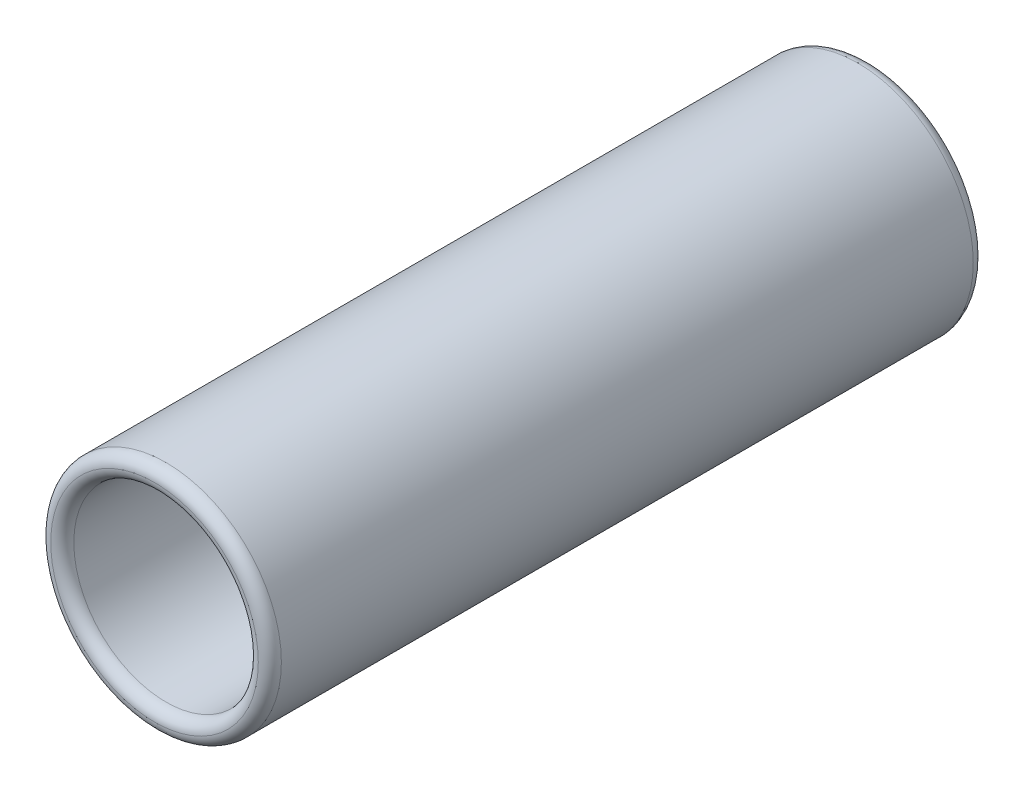
ISO-10303-21;
HEADER;
FILE_DESCRIPTION(('STEP AP214'),'2;1');
FILE_NAME('part.step','',(''),(''),'','','');
FILE_SCHEMA(('AUTOMOTIVE_DESIGN { 1 0 10303 214 1 1 1 1 }'));
ENDSEC;
DATA;
#1=APPLICATION_CONTEXT('core data for automotive mechanical design processes');
#2=APPLICATION_PROTOCOL_DEFINITION('international standard','automotive_design',2000,#1);
#3=PRODUCT_CONTEXT('',#1,'mechanical');
#4=PRODUCT('Part','Part','',(#3));
#5=PRODUCT_RELATED_PRODUCT_CATEGORY('part','',(#4));
#6=PRODUCT_DEFINITION_FORMATION('','',#4);
#7=PRODUCT_DEFINITION_CONTEXT('part definition',#1,'design');
#8=PRODUCT_DEFINITION('design','',#6,#7);
#9=PRODUCT_DEFINITION_SHAPE('','',#8);
#10=(LENGTH_UNIT() NAMED_UNIT(*) SI_UNIT(.MILLI.,.METRE.));
#11=(NAMED_UNIT(*) PLANE_ANGLE_UNIT() SI_UNIT($,.RADIAN.));
#12=(NAMED_UNIT(*) SI_UNIT($,.STERADIAN.) SOLID_ANGLE_UNIT());
#13=UNCERTAINTY_MEASURE_WITH_UNIT(LENGTH_MEASURE(1.E-05),#10,'distance_accuracy_value','');
#14=(GEOMETRIC_REPRESENTATION_CONTEXT(3) GLOBAL_UNCERTAINTY_ASSIGNED_CONTEXT((#13)) GLOBAL_UNIT_ASSIGNED_CONTEXT((#10,
#11,#12)) REPRESENTATION_CONTEXT('',''));
#15=CARTESIAN_POINT('',(0.,0.,0.));
#16=DIRECTION('',(0.,0.,1.));
#17=DIRECTION('',(1.,0.,0.));
#18=AXIS2_PLACEMENT_3D('',#15,#16,#17);
#19=CARTESIAN_POINT('',(0.,0.,0.05));
#20=DIRECTION('',(0.,0.,1.));
#21=DIRECTION('',(1.,0.,0.));
#22=AXIS2_PLACEMENT_3D('',#19,#20,#21);
#23=TOROIDAL_SURFACE('',#22,0.45,0.05);
#24=CARTESIAN_POINT('',(0.,0.,0.05));
#25=DIRECTION('',(0.,0.,1.));
#26=DIRECTION('',(1.,0.,0.));
#27=AXIS2_PLACEMENT_3D('',#24,#25,#26);
#28=CIRCLE('',#27,0.4);
#29=CARTESIAN_POINT('',(0.4,0.,0.05));
#30=VERTEX_POINT('',#29);
#31=EDGE_CURVE('E10',#30,#30,#28,.F.);
#32=ORIENTED_EDGE('',*,*,#31,.F.);
#33=EDGE_LOOP('',(#32));
#34=FACE_BOUND('',#33,.T.);
#35=CARTESIAN_POINT('',(0.,0.,0.));
#36=DIRECTION('',(0.,0.,1.));
#37=DIRECTION('',(1.,0.,0.));
#38=AXIS2_PLACEMENT_3D('',#35,#36,#37);
#39=CIRCLE('',#38,0.45);
#40=CARTESIAN_POINT('',(0.45,0.,0.));
#41=VERTEX_POINT('',#40);
#42=EDGE_CURVE('E39',#41,#41,#39,.F.);
#43=ORIENTED_EDGE('',*,*,#42,.T.);
#44=EDGE_LOOP('',(#43));
#45=FACE_BOUND('',#44,.T.);
#46=ADVANCED_FACE('F33',(#34,#45),#23,.T.);
#47=CARTESIAN_POINT('',(0.,0.,0.0500000000000001));
#48=DIRECTION('',(0.,0.,1.));
#49=DIRECTION('',(1.,0.,0.));
#50=AXIS2_PLACEMENT_3D('',#47,#48,#49);
#51=TOROIDAL_SURFACE('',#50,0.45,0.05);
#52=CARTESIAN_POINT('',(0.,0.,0.0500000000000001));
#53=DIRECTION('',(0.,0.,1.));
#54=DIRECTION('',(1.,0.,0.));
#55=AXIS2_PLACEMENT_3D('',#52,#53,#54);
#56=CIRCLE('',#55,0.5);
#57=CARTESIAN_POINT('',(0.5,0.,0.0500000000000001));
#58=VERTEX_POINT('',#57);
#59=EDGE_CURVE('E43',#58,#58,#56,.T.);
#60=ORIENTED_EDGE('',*,*,#59,.F.);
#61=EDGE_LOOP('',(#60));
#62=FACE_BOUND('',#61,.T.);
#63=ORIENTED_EDGE('',*,*,#42,.F.);
#64=EDGE_LOOP('',(#63));
#65=FACE_BOUND('',#64,.T.);
#66=ADVANCED_FACE('F77',(#62,#65),#51,.T.);
#67=CARTESIAN_POINT('',(0.,0.,3.05));
#68=DIRECTION('',(0.,0.,1.));
#69=DIRECTION('',(1.,0.,0.));
#70=AXIS2_PLACEMENT_3D('',#67,#68,#69);
#71=TOROIDAL_SURFACE('',#70,0.45,0.05);
#72=CARTESIAN_POINT('',(0.,0.,3.05));
#73=DIRECTION('',(0.,0.,1.));
#74=DIRECTION('',(1.,0.,0.));
#75=AXIS2_PLACEMENT_3D('',#72,#73,#74);
#76=CIRCLE('',#75,0.4);
#77=CARTESIAN_POINT('',(0.4,0.,3.05));
#78=VERTEX_POINT('',#77);
#79=EDGE_CURVE('E47',#78,#78,#76,.T.);
#80=ORIENTED_EDGE('',*,*,#79,.F.);
#81=EDGE_LOOP('',(#80));
#82=FACE_BOUND('',#81,.T.);
#83=CARTESIAN_POINT('',(0.,0.,3.1));
#84=DIRECTION('',(0.,0.,1.));
#85=DIRECTION('',(1.,0.,0.));
#86=AXIS2_PLACEMENT_3D('',#83,#84,#85);
#87=CIRCLE('',#86,0.45);
#88=CARTESIAN_POINT('',(0.45,0.,3.1));
#89=VERTEX_POINT('',#88);
#90=EDGE_CURVE('E55',#89,#89,#87,.T.);
#91=ORIENTED_EDGE('',*,*,#90,.T.);
#92=EDGE_LOOP('',(#91));
#93=FACE_BOUND('',#92,.T.);
#94=ADVANCED_FACE('F59',(#82,#93),#71,.T.);
#95=CARTESIAN_POINT('',(0.,0.,3.05));
#96=DIRECTION('',(0.,0.,1.));
#97=DIRECTION('',(1.,0.,0.));
#98=AXIS2_PLACEMENT_3D('',#95,#96,#97);
#99=TOROIDAL_SURFACE('',#98,0.45,0.05);
#100=ORIENTED_EDGE('',*,*,#90,.F.);
#101=EDGE_LOOP('',(#100));
#102=FACE_BOUND('',#101,.T.);
#103=CARTESIAN_POINT('',(0.,0.,3.05));
#104=DIRECTION('',(0.,0.,1.));
#105=DIRECTION('',(1.,0.,0.));
#106=AXIS2_PLACEMENT_3D('',#103,#104,#105);
#107=CIRCLE('',#106,0.5);
#108=CARTESIAN_POINT('',(0.5,0.,3.05));
#109=VERTEX_POINT('',#108);
#110=EDGE_CURVE('E52',#109,#109,#107,.F.);
#111=ORIENTED_EDGE('',*,*,#110,.F.);
#112=EDGE_LOOP('',(#111));
#113=FACE_BOUND('',#112,.T.);
#114=ADVANCED_FACE('F61',(#102,#113),#99,.T.);
#115=CARTESIAN_POINT('',(0.,0.,3.1));
#116=DIRECTION('',(0.,0.,-1.));
#117=DIRECTION('',(-1.,0.,0.));
#118=AXIS2_PLACEMENT_3D('',#115,#116,#117);
#119=CYLINDRICAL_SURFACE('',#118,0.5);
#120=ORIENTED_EDGE('',*,*,#59,.T.);
#121=EDGE_LOOP('',(#120));
#122=FACE_BOUND('',#121,.T.);
#123=ORIENTED_EDGE('',*,*,#110,.T.);
#124=EDGE_LOOP('',(#123));
#125=FACE_BOUND('',#124,.T.);
#126=ADVANCED_FACE('F64',(#122,#125),#119,.T.);
#127=CARTESIAN_POINT('',(0.,0.,0.));
#128=DIRECTION('',(0.,0.,1.));
#129=DIRECTION('',(1.,0.,0.));
#130=AXIS2_PLACEMENT_3D('',#127,#128,#129);
#131=CYLINDRICAL_SURFACE('',#130,0.4);
#132=ORIENTED_EDGE('',*,*,#31,.T.);
#133=EDGE_LOOP('',(#132));
#134=FACE_BOUND('',#133,.T.);
#135=ORIENTED_EDGE('',*,*,#79,.T.);
#136=EDGE_LOOP('',(#135));
#137=FACE_BOUND('',#136,.T.);
#138=ADVANCED_FACE('F69',(#134,#137),#131,.F.);
#139=CLOSED_SHELL('',(#46,#66,#94,#114,#126,#138));
#140=MANIFOLD_SOLID_BREP('B2',#139);
#141=ADVANCED_BREP_SHAPE_REPRESENTATION('',(#18,#140),#14);
#142=SHAPE_DEFINITION_REPRESENTATION(#9,#141);
ENDSEC;
END-ISO-10303-21;
